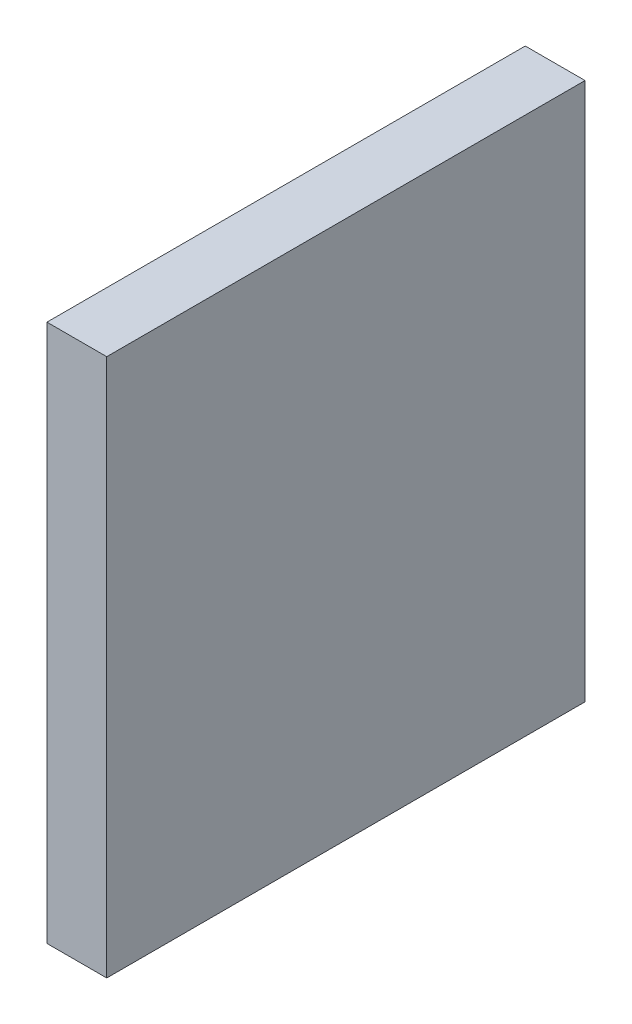
ISO-10303-21;
HEADER;
FILE_DESCRIPTION(('STEP AP214'),'2;1');
FILE_NAME('part.step','',(''),(''),'','','');
FILE_SCHEMA(('AUTOMOTIVE_DESIGN { 1 0 10303 214 1 1 1 1 }'));
ENDSEC;
DATA;
#1=APPLICATION_CONTEXT('core data for automotive mechanical design processes');
#2=APPLICATION_PROTOCOL_DEFINITION('international standard','automotive_design',2000,#1);
#3=PRODUCT_CONTEXT('',#1,'mechanical');
#4=PRODUCT('Part','Part','',(#3));
#5=PRODUCT_RELATED_PRODUCT_CATEGORY('part','',(#4));
#6=PRODUCT_DEFINITION_FORMATION('','',#4);
#7=PRODUCT_DEFINITION_CONTEXT('part definition',#1,'design');
#8=PRODUCT_DEFINITION('design','',#6,#7);
#9=PRODUCT_DEFINITION_SHAPE('','',#8);
#10=(LENGTH_UNIT() NAMED_UNIT(*) SI_UNIT(.MILLI.,.METRE.));
#11=(NAMED_UNIT(*) PLANE_ANGLE_UNIT() SI_UNIT($,.RADIAN.));
#12=(NAMED_UNIT(*) SI_UNIT($,.STERADIAN.) SOLID_ANGLE_UNIT());
#13=UNCERTAINTY_MEASURE_WITH_UNIT(LENGTH_MEASURE(1.E-05),#10,'distance_accuracy_value','');
#14=(GEOMETRIC_REPRESENTATION_CONTEXT(3) GLOBAL_UNCERTAINTY_ASSIGNED_CONTEXT((#13)) GLOBAL_UNIT_ASSIGNED_CONTEXT((#10,
#11,#12)) REPRESENTATION_CONTEXT('',''));
#15=CARTESIAN_POINT('',(0.,0.,0.));
#16=DIRECTION('',(0.,0.,1.));
#17=DIRECTION('',(1.,0.,0.));
#18=AXIS2_PLACEMENT_3D('',#15,#16,#17);
#19=CARTESIAN_POINT('',(0.,114.3,0.));
#20=DIRECTION('',(1.,0.,0.));
#21=DIRECTION('',(0.,0.,-1.));
#22=AXIS2_PLACEMENT_3D('',#19,#20,#21);
#23=PLANE('',#22);
#24=DIRECTION('',(0.,0.,1.));
#25=VECTOR('',#24,1.);
#26=CARTESIAN_POINT('',(0.,0.,0.));
#27=LINE('',#26,#25);
#28=CARTESIAN_POINT('',(0.,0.,-101.6));
#29=VERTEX_POINT('',#28);
#30=CARTESIAN_POINT('',(0.,0.,0.));
#31=VERTEX_POINT('',#30);
#32=EDGE_CURVE('E107',#29,#31,#27,.T.);
#33=ORIENTED_EDGE('',*,*,#32,.T.);
#34=DIRECTION('',(0.,-1.,0.));
#35=VECTOR('',#34,1.);
#36=CARTESIAN_POINT('',(0.,114.3,0.));
#37=LINE('',#36,#35);
#38=CARTESIAN_POINT('',(0.,114.3,0.));
#39=VERTEX_POINT('',#38);
#40=EDGE_CURVE('E11',#39,#31,#37,.T.);
#41=ORIENTED_EDGE('',*,*,#40,.F.);
#42=DIRECTION('',(0.,0.,1.));
#43=VECTOR('',#42,1.);
#44=CARTESIAN_POINT('',(0.,114.3,0.));
#45=LINE('',#44,#43);
#46=CARTESIAN_POINT('',(0.,114.3,-101.6));
#47=VERTEX_POINT('',#46);
#48=EDGE_CURVE('E91',#47,#39,#45,.T.);
#49=ORIENTED_EDGE('',*,*,#48,.F.);
#50=DIRECTION('',(0.,-1.,0.));
#51=VECTOR('',#50,1.);
#52=CARTESIAN_POINT('',(0.,114.3,-101.6));
#53=LINE('',#52,#51);
#54=EDGE_CURVE('E103',#47,#29,#53,.T.);
#55=ORIENTED_EDGE('',*,*,#54,.T.);
#56=EDGE_LOOP('',(#33,#41,#49,#55));
#57=FACE_BOUND('',#56,.T.);
#58=ADVANCED_FACE('F39',(#57),#23,.F.);
#59=CARTESIAN_POINT('',(0.,114.3,0.));
#60=DIRECTION('',(0.,0.,-1.));
#61=DIRECTION('',(-1.,0.,0.));
#62=AXIS2_PLACEMENT_3D('',#59,#60,#61);
#63=PLANE('',#62);
#64=DIRECTION('',(1.,0.,0.));
#65=VECTOR('',#64,1.);
#66=CARTESIAN_POINT('',(0.,0.,0.));
#67=LINE('',#66,#65);
#68=CARTESIAN_POINT('',(12.7,0.,0.));
#69=VERTEX_POINT('',#68);
#70=EDGE_CURVE('E96',#31,#69,#67,.T.);
#71=ORIENTED_EDGE('',*,*,#70,.T.);
#72=DIRECTION('',(0.,-1.,0.));
#73=VECTOR('',#72,1.);
#74=CARTESIAN_POINT('',(12.7,114.3,0.));
#75=LINE('',#74,#73);
#76=CARTESIAN_POINT('',(12.7,114.3,0.));
#77=VERTEX_POINT('',#76);
#78=EDGE_CURVE('E48',#77,#69,#75,.T.);
#79=ORIENTED_EDGE('',*,*,#78,.F.);
#80=DIRECTION('',(1.,0.,0.));
#81=VECTOR('',#80,1.);
#82=CARTESIAN_POINT('',(0.,114.3,0.));
#83=LINE('',#82,#81);
#84=EDGE_CURVE('E86',#39,#77,#83,.T.);
#85=ORIENTED_EDGE('',*,*,#84,.F.);
#86=ORIENTED_EDGE('',*,*,#40,.T.);
#87=EDGE_LOOP('',(#71,#79,#85,#86));
#88=FACE_BOUND('',#87,.T.);
#89=ADVANCED_FACE('F95',(#88),#63,.F.);
#90=CARTESIAN_POINT('',(12.7,114.3,0.));
#91=DIRECTION('',(-1.,0.,0.));
#92=DIRECTION('',(0.,0.,1.));
#93=AXIS2_PLACEMENT_3D('',#90,#91,#92);
#94=PLANE('',#93);
#95=DIRECTION('',(0.,0.,-1.));
#96=VECTOR('',#95,1.);
#97=CARTESIAN_POINT('',(12.7,0.,0.));
#98=LINE('',#97,#96);
#99=CARTESIAN_POINT('',(12.7,0.,-101.6));
#100=VERTEX_POINT('',#99);
#101=EDGE_CURVE('E73',#69,#100,#98,.T.);
#102=ORIENTED_EDGE('',*,*,#101,.T.);
#103=DIRECTION('',(0.,-1.,0.));
#104=VECTOR('',#103,1.);
#105=CARTESIAN_POINT('',(12.7,114.3,-101.6));
#106=LINE('',#105,#104);
#107=CARTESIAN_POINT('',(12.7,114.3,-101.6));
#108=VERTEX_POINT('',#107);
#109=EDGE_CURVE('E98',#108,#100,#106,.T.);
#110=ORIENTED_EDGE('',*,*,#109,.F.);
#111=DIRECTION('',(0.,0.,-1.));
#112=VECTOR('',#111,1.);
#113=CARTESIAN_POINT('',(12.7,114.3,0.));
#114=LINE('',#113,#112);
#115=EDGE_CURVE('E89',#77,#108,#114,.T.);
#116=ORIENTED_EDGE('',*,*,#115,.F.);
#117=ORIENTED_EDGE('',*,*,#78,.T.);
#118=EDGE_LOOP('',(#102,#110,#116,#117));
#119=FACE_BOUND('',#118,.T.);
#120=ADVANCED_FACE('F99',(#119),#94,.F.);
#121=CARTESIAN_POINT('',(0.,114.3,-101.6));
#122=DIRECTION('',(0.,0.,1.));
#123=DIRECTION('',(1.,0.,0.));
#124=AXIS2_PLACEMENT_3D('',#121,#122,#123);
#125=PLANE('',#124);
#126=DIRECTION('',(-1.,0.,0.));
#127=VECTOR('',#126,1.);
#128=CARTESIAN_POINT('',(0.,0.,-101.6));
#129=LINE('',#128,#127);
#130=EDGE_CURVE('E79',#100,#29,#129,.T.);
#131=ORIENTED_EDGE('',*,*,#130,.T.);
#132=ORIENTED_EDGE('',*,*,#54,.F.);
#133=DIRECTION('',(-1.,0.,0.));
#134=VECTOR('',#133,1.);
#135=CARTESIAN_POINT('',(0.,114.3,-101.6));
#136=LINE('',#135,#134);
#137=EDGE_CURVE('E56',#108,#47,#136,.T.);
#138=ORIENTED_EDGE('',*,*,#137,.F.);
#139=ORIENTED_EDGE('',*,*,#109,.T.);
#140=EDGE_LOOP('',(#131,#132,#138,#139));
#141=FACE_BOUND('',#140,.T.);
#142=ADVANCED_FACE('F120',(#141),#125,.F.);
#143=CARTESIAN_POINT('',(0.,114.3,0.));
#144=DIRECTION('',(0.,-1.,0.));
#145=DIRECTION('',(0.,0.,-1.));
#146=AXIS2_PLACEMENT_3D('',#143,#144,#145);
#147=PLANE('',#146);
#148=ORIENTED_EDGE('',*,*,#48,.T.);
#149=ORIENTED_EDGE('',*,*,#84,.T.);
#150=ORIENTED_EDGE('',*,*,#115,.T.);
#151=ORIENTED_EDGE('',*,*,#137,.T.);
#152=EDGE_LOOP('',(#148,#149,#150,#151));
#153=FACE_BOUND('',#152,.T.);
#154=ADVANCED_FACE('F87',(#153),#147,.F.);
#155=CARTESIAN_POINT('',(0.,0.,0.));
#156=DIRECTION('',(0.,-1.,0.));
#157=DIRECTION('',(0.,0.,-1.));
#158=AXIS2_PLACEMENT_3D('',#155,#156,#157);
#159=PLANE('',#158);
#160=ORIENTED_EDGE('',*,*,#32,.F.);
#161=ORIENTED_EDGE('',*,*,#130,.F.);
#162=ORIENTED_EDGE('',*,*,#101,.F.);
#163=ORIENTED_EDGE('',*,*,#70,.F.);
#164=EDGE_LOOP('',(#160,#161,#162,#163));
#165=FACE_BOUND('',#164,.T.);
#166=ADVANCED_FACE('F123',(#165),#159,.T.);
#167=CLOSED_SHELL('',(#58,#89,#120,#142,#154,#166));
#168=MANIFOLD_SOLID_BREP('B2',#167);
#169=ADVANCED_BREP_SHAPE_REPRESENTATION('',(#18,#168),#14);
#170=SHAPE_DEFINITION_REPRESENTATION(#9,#169);
ENDSEC;
END-ISO-10303-21;
